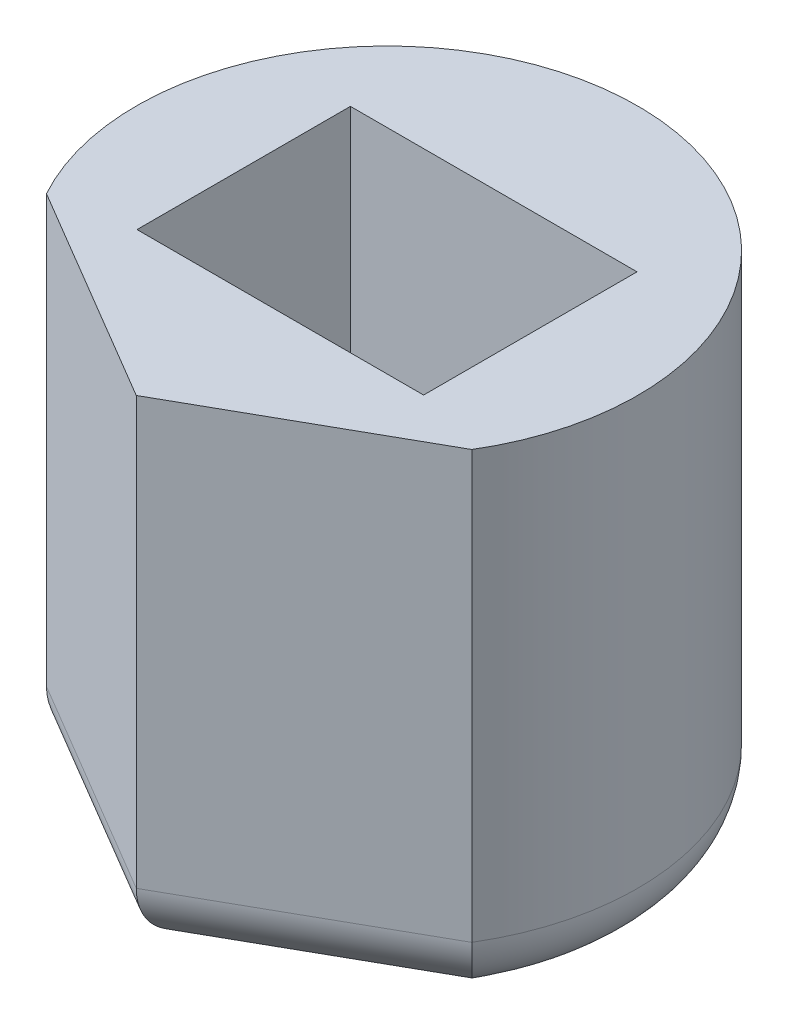
ISO-10303-21;
HEADER;
FILE_DESCRIPTION(('STEP AP214'),'2;1');
FILE_NAME('part.step','',(''),(''),'','','');
FILE_SCHEMA(('AUTOMOTIVE_DESIGN { 1 0 10303 214 1 1 1 1 }'));
ENDSEC;
DATA;
#1=APPLICATION_CONTEXT('core data for automotive mechanical design processes');
#2=APPLICATION_PROTOCOL_DEFINITION('international standard','automotive_design',2000,#1);
#3=PRODUCT_CONTEXT('',#1,'mechanical');
#4=PRODUCT('Part','Part','',(#3));
#5=PRODUCT_RELATED_PRODUCT_CATEGORY('part','',(#4));
#6=PRODUCT_DEFINITION_FORMATION('','',#4);
#7=PRODUCT_DEFINITION_CONTEXT('part definition',#1,'design');
#8=PRODUCT_DEFINITION('design','',#6,#7);
#9=PRODUCT_DEFINITION_SHAPE('','',#8);
#10=(LENGTH_UNIT() NAMED_UNIT(*) SI_UNIT(.MILLI.,.METRE.));
#11=(NAMED_UNIT(*) PLANE_ANGLE_UNIT() SI_UNIT($,.RADIAN.));
#12=(NAMED_UNIT(*) SI_UNIT($,.STERADIAN.) SOLID_ANGLE_UNIT());
#13=UNCERTAINTY_MEASURE_WITH_UNIT(LENGTH_MEASURE(1.E-05),#10,'distance_accuracy_value','');
#14=(GEOMETRIC_REPRESENTATION_CONTEXT(3) GLOBAL_UNCERTAINTY_ASSIGNED_CONTEXT((#13)) GLOBAL_UNIT_ASSIGNED_CONTEXT((#10,
#11,#12)) REPRESENTATION_CONTEXT('',''));
#15=CARTESIAN_POINT('',(0.,0.,0.));
#16=DIRECTION('',(0.,0.,1.));
#17=DIRECTION('',(1.,0.,0.));
#18=AXIS2_PLACEMENT_3D('',#15,#16,#17);
#19=CARTESIAN_POINT('',(2.35,6.,-1.75));
#20=DIRECTION('',(-1.,0.,0.));
#21=DIRECTION('',(0.,0.,1.));
#22=AXIS2_PLACEMENT_3D('',#19,#20,#21);
#23=PLANE('',#22);
#24=DIRECTION('',(0.,-1.,0.));
#25=VECTOR('',#24,1.);
#26=CARTESIAN_POINT('',(2.35,6.,-1.75));
#27=LINE('',#26,#25);
#28=CARTESIAN_POINT('',(2.35,6.,-1.75));
#29=VERTEX_POINT('',#28);
#30=CARTESIAN_POINT('',(2.35,0.,-1.75));
#31=VERTEX_POINT('',#30);
#32=EDGE_CURVE('E150',#29,#31,#27,.T.);
#33=ORIENTED_EDGE('',*,*,#32,.T.);
#34=DIRECTION('',(0.,0.,1.));
#35=VECTOR('',#34,1.);
#36=CARTESIAN_POINT('',(2.35,0.,1.75));
#37=LINE('',#36,#35);
#38=CARTESIAN_POINT('',(2.35,0.,1.75));
#39=VERTEX_POINT('',#38);
#40=EDGE_CURVE('E131',#31,#39,#37,.T.);
#41=ORIENTED_EDGE('',*,*,#40,.T.);
#42=DIRECTION('',(0.,-1.,0.));
#43=VECTOR('',#42,1.);
#44=CARTESIAN_POINT('',(2.35,6.,1.75));
#45=LINE('',#44,#43);
#46=CARTESIAN_POINT('',(2.35,6.,1.75));
#47=VERTEX_POINT('',#46);
#48=EDGE_CURVE('E154',#47,#39,#45,.T.);
#49=ORIENTED_EDGE('',*,*,#48,.F.);
#50=DIRECTION('',(0.,0.,-1.));
#51=VECTOR('',#50,1.);
#52=CARTESIAN_POINT('',(2.35,6.,-1.75));
#53=LINE('',#52,#51);
#54=EDGE_CURVE('E271',#47,#29,#53,.T.);
#55=ORIENTED_EDGE('',*,*,#54,.T.);
#56=EDGE_LOOP('',(#33,#41,#49,#55));
#57=FACE_BOUND('',#56,.T.);
#58=ADVANCED_FACE('F35',(#57),#23,.T.);
#59=CARTESIAN_POINT('',(-2.35,6.,-1.75));
#60=DIRECTION('',(0.,0.,1.));
#61=DIRECTION('',(1.,0.,0.));
#62=AXIS2_PLACEMENT_3D('',#59,#60,#61);
#63=PLANE('',#62);
#64=DIRECTION('',(0.,-1.,0.));
#65=VECTOR('',#64,1.);
#66=CARTESIAN_POINT('',(-2.35,6.,-1.75));
#67=LINE('',#66,#65);
#68=CARTESIAN_POINT('',(-2.35,6.,-1.75));
#69=VERTEX_POINT('',#68);
#70=CARTESIAN_POINT('',(-2.35,0.,-1.75));
#71=VERTEX_POINT('',#70);
#72=EDGE_CURVE('E142',#69,#71,#67,.T.);
#73=ORIENTED_EDGE('',*,*,#72,.T.);
#74=DIRECTION('',(1.,0.,0.));
#75=VECTOR('',#74,1.);
#76=CARTESIAN_POINT('',(-2.35,0.,-1.75));
#77=LINE('',#76,#75);
#78=EDGE_CURVE('E128',#71,#31,#77,.T.);
#79=ORIENTED_EDGE('',*,*,#78,.T.);
#80=ORIENTED_EDGE('',*,*,#32,.F.);
#81=DIRECTION('',(-1.,0.,0.));
#82=VECTOR('',#81,1.);
#83=CARTESIAN_POINT('',(-2.35,6.,-1.75));
#84=LINE('',#83,#82);
#85=EDGE_CURVE('E149',#29,#69,#84,.T.);
#86=ORIENTED_EDGE('',*,*,#85,.T.);
#87=EDGE_LOOP('',(#73,#79,#80,#86));
#88=FACE_BOUND('',#87,.T.);
#89=ADVANCED_FACE('F147',(#88),#63,.T.);
#90=CARTESIAN_POINT('',(-2.35,6.,-1.75));
#91=DIRECTION('',(1.,0.,0.));
#92=DIRECTION('',(0.,0.,-1.));
#93=AXIS2_PLACEMENT_3D('',#90,#91,#92);
#94=PLANE('',#93);
#95=DIRECTION('',(0.,-1.,0.));
#96=VECTOR('',#95,1.);
#97=CARTESIAN_POINT('',(-2.35,6.,1.75));
#98=LINE('',#97,#96);
#99=CARTESIAN_POINT('',(-2.35,6.,1.75));
#100=VERTEX_POINT('',#99);
#101=CARTESIAN_POINT('',(-2.35,0.,1.75));
#102=VERTEX_POINT('',#101);
#103=EDGE_CURVE('E144',#100,#102,#98,.T.);
#104=ORIENTED_EDGE('',*,*,#103,.T.);
#105=DIRECTION('',(0.,0.,-1.));
#106=VECTOR('',#105,1.);
#107=CARTESIAN_POINT('',(-2.35,0.,1.75));
#108=LINE('',#107,#106);
#109=EDGE_CURVE('E53',#102,#71,#108,.T.);
#110=ORIENTED_EDGE('',*,*,#109,.T.);
#111=ORIENTED_EDGE('',*,*,#72,.F.);
#112=DIRECTION('',(0.,0.,1.));
#113=VECTOR('',#112,1.);
#114=CARTESIAN_POINT('',(-2.35,6.,-1.75));
#115=LINE('',#114,#113);
#116=EDGE_CURVE('E274',#69,#100,#115,.T.);
#117=ORIENTED_EDGE('',*,*,#116,.T.);
#118=EDGE_LOOP('',(#104,#110,#111,#117));
#119=FACE_BOUND('',#118,.T.);
#120=ADVANCED_FACE('F140',(#119),#94,.T.);
#121=CARTESIAN_POINT('',(-2.35,6.,1.75));
#122=DIRECTION('',(0.,0.,-1.));
#123=DIRECTION('',(-1.,0.,0.));
#124=AXIS2_PLACEMENT_3D('',#121,#122,#123);
#125=PLANE('',#124);
#126=ORIENTED_EDGE('',*,*,#48,.T.);
#127=DIRECTION('',(-1.,0.,0.));
#128=VECTOR('',#127,1.);
#129=CARTESIAN_POINT('',(-2.35,0.,1.75));
#130=LINE('',#129,#128);
#131=EDGE_CURVE('E280',#39,#102,#130,.T.);
#132=ORIENTED_EDGE('',*,*,#131,.T.);
#133=ORIENTED_EDGE('',*,*,#103,.F.);
#134=DIRECTION('',(1.,0.,0.));
#135=VECTOR('',#134,1.);
#136=CARTESIAN_POINT('',(-2.35,6.,1.75));
#137=LINE('',#136,#135);
#138=EDGE_CURVE('E276',#100,#47,#137,.T.);
#139=ORIENTED_EDGE('',*,*,#138,.T.);
#140=EDGE_LOOP('',(#126,#132,#133,#139));
#141=FACE_BOUND('',#140,.T.);
#142=ADVANCED_FACE('F229',(#141),#125,.T.);
#143=CARTESIAN_POINT('',(0.,6.,0.));
#144=DIRECTION('',(0.,1.,0.));
#145=DIRECTION('',(0.,0.,1.));
#146=AXIS2_PLACEMENT_3D('',#143,#144,#145);
#147=PLANE('',#146);
#148=DIRECTION('',(-0.871083125525588,0.,0.491135611032812));
#149=VECTOR('',#148,1.);
#150=CARTESIAN_POINT('',(0.,6.,4.11181198358812));
#151=LINE('',#150,#149);
#152=CARTESIAN_POINT('',(3.51823033783962,6.,2.12815720243683));
#153=VERTEX_POINT('',#152);
#154=CARTESIAN_POINT('',(0.,6.,4.11181198358812));
#155=VERTEX_POINT('',#154);
#156=EDGE_CURVE('E259',#153,#155,#151,.T.);
#157=ORIENTED_EDGE('',*,*,#156,.F.);
#158=CARTESIAN_POINT('',(0.,6.,0.));
#159=DIRECTION('',(0.,1.,0.));
#160=DIRECTION('',(0.,0.,1.));
#161=AXIS2_PLACEMENT_3D('',#158,#159,#160);
#162=CIRCLE('',#161,4.11181198358812);
#163=CARTESIAN_POINT('',(-3.60215336947691,6.,1.98279824771584));
#164=VERTEX_POINT('',#163);
#165=EDGE_CURVE('E152',#153,#164,#162,.T.);
#166=ORIENTED_EDGE('',*,*,#165,.T.);
#167=DIRECTION('',(-0.860877478620404,0.,-0.508812309996698));
#168=VECTOR('',#167,1.);
#169=CARTESIAN_POINT('',(0.,6.,4.11181198358812));
#170=LINE('',#169,#168);
#171=EDGE_CURVE('E260',#155,#164,#170,.T.);
#172=ORIENTED_EDGE('',*,*,#171,.F.);
#173=EDGE_LOOP('',(#157,#166,#172));
#174=FACE_BOUND('',#173,.T.);
#175=ORIENTED_EDGE('',*,*,#85,.F.);
#176=ORIENTED_EDGE('',*,*,#54,.F.);
#177=ORIENTED_EDGE('',*,*,#138,.F.);
#178=ORIENTED_EDGE('',*,*,#116,.F.);
#179=EDGE_LOOP('',(#175,#176,#177,#178));
#180=FACE_BOUND('',#179,.T.);
#181=ADVANCED_FACE('F226',(#174,#180),#147,.T.);
#182=CARTESIAN_POINT('',(0.,6.,0.));
#183=DIRECTION('',(0.,-1.,0.));
#184=DIRECTION('',(0.,0.,-1.));
#185=AXIS2_PLACEMENT_3D('',#182,#183,#184);
#186=CYLINDRICAL_SURFACE('',#185,4.11181198358812);
#187=DIRECTION('',(0.,-1.,0.));
#188=VECTOR('',#187,1.);
#189=CARTESIAN_POINT('',(3.51823033783962,6.,2.12815720243683));
#190=LINE('',#189,#188);
#191=CARTESIAN_POINT('',(3.51823033783962,-1.,2.12815720243683));
#192=VERTEX_POINT('',#191);
#193=EDGE_CURVE('E162',#153,#192,#190,.T.);
#194=ORIENTED_EDGE('',*,*,#193,.T.);
#195=CARTESIAN_POINT('',(0.,-1.,0.));
#196=DIRECTION('',(0.,-1.,0.));
#197=DIRECTION('',(0.,0.,-1.));
#198=AXIS2_PLACEMENT_3D('',#195,#196,#197);
#199=CIRCLE('',#198,4.11181198358812);
#200=CARTESIAN_POINT('',(-3.60215336947691,-1.,1.98279824771583));
#201=VERTEX_POINT('',#200);
#202=EDGE_CURVE('E176',#192,#201,#199,.F.);
#203=ORIENTED_EDGE('',*,*,#202,.T.);
#204=DIRECTION('',(0.,-1.,0.));
#205=VECTOR('',#204,1.);
#206=CARTESIAN_POINT('',(-3.60215336947691,6.,1.98279824771583));
#207=LINE('',#206,#205);
#208=EDGE_CURVE('E160',#201,#164,#207,.F.);
#209=ORIENTED_EDGE('',*,*,#208,.T.);
#210=ORIENTED_EDGE('',*,*,#165,.F.);
#211=EDGE_LOOP('',(#194,#203,#209,#210));
#212=FACE_BOUND('',#211,.T.);
#213=ADVANCED_FACE('F228',(#212),#186,.T.);
#214=CARTESIAN_POINT('',(0.,0.,4.11181198358812));
#215=DIRECTION('',(-0.491135611032812,0.,-0.871083125525588));
#216=DIRECTION('',(-0.871083125525588,0.,0.491135611032812));
#217=AXIS2_PLACEMENT_3D('',#214,#215,#216);
#218=PLANE('',#217);
#219=DIRECTION('',(0.,1.,0.));
#220=VECTOR('',#219,1.);
#221=CARTESIAN_POINT('',(0.,0.,4.11181198358812));
#222=LINE('',#221,#220);
#223=CARTESIAN_POINT('',(0.,-1.,4.11181198358812));
#224=VERTEX_POINT('',#223);
#225=EDGE_CURVE('E264',#224,#155,#222,.T.);
#226=ORIENTED_EDGE('',*,*,#225,.F.);
#227=DIRECTION('',(-0.871083125525588,0.,0.491135611032812));
#228=VECTOR('',#227,1.);
#229=CARTESIAN_POINT('',(3.51823033783962,-1.,2.12815720243683));
#230=LINE('',#229,#228);
#231=EDGE_CURVE('E11',#224,#192,#230,.F.);
#232=ORIENTED_EDGE('',*,*,#231,.T.);
#233=ORIENTED_EDGE('',*,*,#193,.F.);
#234=ORIENTED_EDGE('',*,*,#156,.T.);
#235=EDGE_LOOP('',(#226,#232,#233,#234));
#236=FACE_BOUND('',#235,.T.);
#237=ADVANCED_FACE('F232',(#236),#218,.F.);
#238=CARTESIAN_POINT('',(0.,0.,4.11181198358812));
#239=DIRECTION('',(0.508812309996698,0.,-0.860877478620404));
#240=DIRECTION('',(-0.860877478620404,0.,-0.508812309996698));
#241=AXIS2_PLACEMENT_3D('',#238,#239,#240);
#242=PLANE('',#241);
#243=ORIENTED_EDGE('',*,*,#208,.F.);
#244=DIRECTION('',(-0.860877478620404,0.,-0.508812309996698));
#245=VECTOR('',#244,1.);
#246=CARTESIAN_POINT('',(0.,-1.,4.11181198358812));
#247=LINE('',#246,#245);
#248=EDGE_CURVE('E61',#201,#224,#247,.F.);
#249=ORIENTED_EDGE('',*,*,#248,.T.);
#250=ORIENTED_EDGE('',*,*,#225,.T.);
#251=ORIENTED_EDGE('',*,*,#171,.T.);
#252=EDGE_LOOP('',(#243,#249,#250,#251));
#253=FACE_BOUND('',#252,.T.);
#254=ADVANCED_FACE('F237',(#253),#242,.F.);
#255=CARTESIAN_POINT('',(0.,-2.,0.));
#256=DIRECTION('',(0.,-1.,0.));
#257=DIRECTION('',(0.,0.,-1.));
#258=AXIS2_PLACEMENT_3D('',#255,#256,#257);
#259=PLANE('',#258);
#260=DIRECTION('',(-0.871083125525588,0.,0.491135611032812));
#261=VECTOR('',#260,1.);
#262=CARTESIAN_POINT('',(-0.491135611032812,-2.,3.24072885806253));
#263=LINE('',#262,#261);
#264=CARTESIAN_POINT('',(2.15283628557141,-2.,1.75));
#265=VERTEX_POINT('',#264);
#266=CARTESIAN_POINT('',(0.0117844659759248,-2.,2.95717158082412));
#267=VERTEX_POINT('',#266);
#268=EDGE_CURVE('E165',#265,#267,#263,.T.);
#269=ORIENTED_EDGE('',*,*,#268,.T.);
#270=DIRECTION('',(-0.860877478620404,0.,-0.508812309996698));
#271=VECTOR('',#270,1.);
#272=CARTESIAN_POINT('',(-3.09334105948021,-2.,1.12192076909543));
#273=LINE('',#272,#271);
#274=CARTESIAN_POINT('',(-2.03067167422403,-2.,1.75));
#275=VERTEX_POINT('',#274);
#276=EDGE_CURVE('E167',#267,#275,#273,.T.);
#277=ORIENTED_EDGE('',*,*,#276,.T.);
#278=DIRECTION('',(-1.,0.,0.));
#279=VECTOR('',#278,1.);
#280=CARTESIAN_POINT('',(-2.35,-2.,1.75));
#281=LINE('',#280,#279);
#282=CARTESIAN_POINT('',(-2.35,-2.,1.75));
#283=VERTEX_POINT('',#282);
#284=EDGE_CURVE('E290',#275,#283,#281,.T.);
#285=ORIENTED_EDGE('',*,*,#284,.T.);
#286=DIRECTION('',(0.,0.,-1.));
#287=VECTOR('',#286,1.);
#288=CARTESIAN_POINT('',(-2.35,-2.,1.75));
#289=LINE('',#288,#287);
#290=CARTESIAN_POINT('',(-2.35,-2.,1.56126445153865));
#291=VERTEX_POINT('',#290);
#292=EDGE_CURVE('E256',#283,#291,#289,.T.);
#293=ORIENTED_EDGE('',*,*,#292,.T.);
#294=DIRECTION('',(-0.860877478620404,0.,-0.508812309996698));
#295=VECTOR('',#294,1.);
#296=CARTESIAN_POINT('',(-3.09334105948021,-2.,1.12192076909543));
#297=LINE('',#296,#295);
#298=CARTESIAN_POINT('',(-2.84015961735463,-2.,1.27156091837969));
#299=VERTEX_POINT('',#298);
#300=EDGE_CURVE('E174',#291,#299,#297,.T.);
#301=ORIENTED_EDGE('',*,*,#300,.T.);
#302=CARTESIAN_POINT('',(0.,-2.,0.));
#303=DIRECTION('',(0.,-1.,0.));
#304=DIRECTION('',(0.,0.,-1.));
#305=AXIS2_PLACEMENT_3D('',#302,#303,#304);
#306=CIRCLE('',#305,3.11181198358812);
#307=CARTESIAN_POINT('',(2.78127029440949,-2.,1.3956752382406));
#308=VERTEX_POINT('',#307);
#309=EDGE_CURVE('E171',#299,#308,#306,.T.);
#310=ORIENTED_EDGE('',*,*,#309,.T.);
#311=DIRECTION('',(-0.871083125525588,0.,0.491135611032812));
#312=VECTOR('',#311,1.);
#313=CARTESIAN_POINT('',(-0.491135611032812,-2.,3.24072885806253));
#314=LINE('',#313,#312);
#315=CARTESIAN_POINT('',(2.35,-2.,1.63883480976519));
#316=VERTEX_POINT('',#315);
#317=EDGE_CURVE('E169',#308,#316,#314,.T.);
#318=ORIENTED_EDGE('',*,*,#317,.T.);
#319=DIRECTION('',(0.,0.,1.));
#320=VECTOR('',#319,1.);
#321=CARTESIAN_POINT('',(2.35,-2.,1.75));
#322=LINE('',#321,#320);
#323=CARTESIAN_POINT('',(2.35,-2.,1.75));
#324=VERTEX_POINT('',#323);
#325=EDGE_CURVE('E288',#316,#324,#322,.T.);
#326=ORIENTED_EDGE('',*,*,#325,.T.);
#327=EDGE_CURVE('E145',#324,#265,#281,.T.);
#328=ORIENTED_EDGE('',*,*,#327,.T.);
#329=EDGE_LOOP('',(#269,#277,#285,#293,#301,#310,#318,#326,#328));
#330=FACE_BOUND('',#329,.T.);
#331=ADVANCED_FACE('F214',(#330),#259,.T.);
#332=CARTESIAN_POINT('',(-1.29226437474176,-1.,2.18642763703157));
#333=DIRECTION('',(0.860877478620404,0.,0.508812309996698));
#334=DIRECTION('',(0.508812309996698,0.,-0.860877478620404));
#335=AXIS2_PLACEMENT_3D('',#332,#333,#334);
#336=CYLINDRICAL_SURFACE('',#335,1.);
#337=CARTESIAN_POINT('',(-2.03067167422403,-1.,1.75));
#338=DIRECTION('',(0.,0.,-1.));
#339=DIRECTION('',(1.,0.,0.));
#340=AXIS2_PLACEMENT_3D('',#337,#338,#339);
#341=ELLIPSE('',#340,1.96536125473554,1.);
#342=CARTESIAN_POINT('',(-2.35,-1.98671213635044,1.75));
#343=VERTEX_POINT('',#342);
#344=EDGE_CURVE('E182',#275,#343,#341,.T.);
#345=ORIENTED_EDGE('',*,*,#344,.F.);
#346=ORIENTED_EDGE('',*,*,#276,.F.);
#347=CARTESIAN_POINT('',(0.0117844659759248,-1.,2.95717158082412));
#348=DIRECTION('',(0.999947921029514,0.,0.0102056469051838));
#349=DIRECTION('',(0.0102056469051838,0.,-0.999947921029514));
#350=AXIS2_PLACEMENT_3D('',#347,#348,#349);
#351=ELLIPSE('',#350,1.15470053837925,1.);
#352=EDGE_CURVE('E40',#224,#267,#351,.T.);
#353=ORIENTED_EDGE('',*,*,#352,.F.);
#354=ORIENTED_EDGE('',*,*,#248,.F.);
#355=CARTESIAN_POINT('',(-3.60215336947691,-1.,1.98279824771583));
#356=CARTESIAN_POINT('',(-3.60215341711431,-1.0273852702056,1.98279858822179));
#357=CARTESIAN_POINT('',(-3.60131566096911,-1.05475718837957,1.98198576931951));
#358=CARTESIAN_POINT('',(-3.59797478681862,-1.10930012740476,1.97874626252752));
#359=CARTESIAN_POINT('',(-3.59547185385305,-1.1364711702387,1.97631975395614));
#360=CARTESIAN_POINT('',(-3.58549692789412,-1.21729677069871,1.96665413199477));
#361=CARTESIAN_POINT('',(-3.57555868673311,-1.27040159732565,1.95702878143871));
#362=CARTESIAN_POINT('',(-3.54940782117867,-1.373518866995,1.93175733329807));
#363=CARTESIAN_POINT('',(-3.53319414648588,-1.4235307907622,1.91611022787399));
#364=CARTESIAN_POINT('',(-3.49497888417345,-1.51913755324321,1.87934405977904));
#365=CARTESIAN_POINT('',(-3.47297714781747,-1.56473227840666,1.8582248564914));
#366=CARTESIAN_POINT('',(-3.42347782837097,-1.65092966744954,1.81089719153305));
#367=CARTESIAN_POINT('',(-3.39590831911899,-1.69145440791704,1.78462226793662));
#368=CARTESIAN_POINT('',(-3.33623681405785,-1.76579555294529,1.72802635222626));
#369=CARTESIAN_POINT('',(-3.30413340356225,-1.79960985573699,1.69770409741015));
#370=CARTESIAN_POINT('',(-3.23510605837195,-1.86079116365881,1.63287255000625));
#371=CARTESIAN_POINT('',(-3.19805622165271,-1.88790278813624,1.59825666363483));
#372=CARTESIAN_POINT('',(-3.12101147275468,-1.93358845277378,1.52675116745616));
#373=CARTESIAN_POINT('',(-3.08101696856371,-1.95216367309179,1.48986187274781));
#374=CARTESIAN_POINT('',(-3.00859139030004,-1.97718864334135,1.42355244733934));
#375=CARTESIAN_POINT('',(-2.97654600234073,-1.98544775936052,1.39437424183376));
#376=CARTESIAN_POINT('',(-2.91181324986686,-1.99666667470804,1.33579152195008));
#377=CARTESIAN_POINT('',(-2.87912716140698,-1.99963610192397,1.30638751676602));
#378=CARTESIAN_POINT('',(-2.84429632491851,-1.99998954795389,1.27525600475632));
#379=CARTESIAN_POINT('',(-2.84222808990674,-2.00000002691314,1.27340818825243));
#380=CARTESIAN_POINT('',(-2.84015961735463,-2.,1.27156091837969));
#381=B_SPLINE_CURVE_WITH_KNOTS('',3,(#355,#356,#357,#358,#359,#360,#361,#362,#363,#364,#365,
#366,#367,#368,#369,#370,#371,#372,#373,#374,#375,#376,#377,#378,#379,#380),.UNSPECIFIED.,.F.,
.F.,(4,2,2,2,2,2,2,2,2,2,2,2,4),(0.,0.0821045475378612,0.164199972882307,0.327982776292728,
0.491793003372148,0.655607440308782,0.821691683199439,0.987827863342561,1.15955719962505,
1.33126278717892,1.4633249754458,1.5951465476534,1.60346686075192),.UNSPECIFIED.);
#382=EDGE_CURVE('E196',#299,#201,#381,.F.);
#383=ORIENTED_EDGE('',*,*,#382,.F.);
#384=ORIENTED_EDGE('',*,*,#300,.F.);
#385=CARTESIAN_POINT('',(-2.35,-1.,1.56126445153865));
#386=DIRECTION('',(1.,0.,0.));
#387=DIRECTION('',(0.,0.,1.));
#388=AXIS2_PLACEMENT_3D('',#385,#386,#387);
#389=ELLIPSE('',#388,1.16160548374729,1.);
#390=EDGE_CURVE('E185',#343,#291,#389,.T.);
#391=ORIENTED_EDGE('',*,*,#390,.F.);
#392=EDGE_LOOP('',(#345,#346,#353,#354,#383,#384,#391));
#393=FACE_BOUND('',#392,.T.);
#394=ADVANCED_FACE('F37',(#393),#336,.T.);
#395=CARTESIAN_POINT('',(1.267979557887,-1.,2.24890146748689));
#396=DIRECTION('',(0.871083125525588,0.,-0.491135611032812));
#397=DIRECTION('',(-0.491135611032812,0.,-0.871083125525588));
#398=AXIS2_PLACEMENT_3D('',#395,#396,#397);
#399=CYLINDRICAL_SURFACE('',#398,1.);
#400=CARTESIAN_POINT('',(2.35,-1.,1.63883480976519));
#401=DIRECTION('',(-1.,0.,0.));
#402=DIRECTION('',(0.,0.,-1.));
#403=AXIS2_PLACEMENT_3D('',#400,#401,#402);
#404=ELLIPSE('',#403,1.14799606455082,1.);
#405=CARTESIAN_POINT('',(2.35,-1.99530053397984,1.75));
#406=VERTEX_POINT('',#405);
#407=EDGE_CURVE('E45',#316,#406,#404,.T.);
#408=ORIENTED_EDGE('',*,*,#407,.F.);
#409=ORIENTED_EDGE('',*,*,#317,.F.);
#410=CARTESIAN_POINT('',(3.51823033783962,-1.,2.12815720243683));
#411=CARTESIAN_POINT('',(3.51823035682849,-1.02744091501146,2.12815751481245));
#412=CARTESIAN_POINT('',(3.51741681832114,-1.05486846931908,2.12731835223006));
#413=CARTESIAN_POINT('',(3.51417233546199,-1.10952266306828,2.12397358912433));
#414=CARTESIAN_POINT('',(3.51174156312683,-1.1367493235665,2.12146816583237));
#415=CARTESIAN_POINT('',(3.50205334669458,-1.21774465530638,2.11148712400532));
#416=CARTESIAN_POINT('',(3.49239989134162,-1.27096309682667,2.10154659547714));
#417=CARTESIAN_POINT('',(3.466992916515,-1.37430354845713,2.07543994343947));
#418=CARTESIAN_POINT('',(3.45123823591032,-1.42442496706277,2.05927263490772));
#419=CARTESIAN_POINT('',(3.41409601485355,-1.52023659733,2.02127096985355));
#420=CARTESIAN_POINT('',(3.3927084374565,-1.56592677992537,1.99943657616195));
#421=CARTESIAN_POINT('',(3.34460255744936,-1.65224820870765,1.95051130385806));
#422=CARTESIAN_POINT('',(3.31781924876383,-1.69280685376446,1.92335644761579));
#423=CARTESIAN_POINT('',(3.25983845639645,-1.76718851642127,1.86484386406415));
#424=CARTESIAN_POINT('',(3.22863958848809,-1.80100941378027,1.83348481895362));
#425=CARTESIAN_POINT('',(3.16162790062843,-1.86208585128089,1.76649347333586));
#426=CARTESIAN_POINT('',(3.12570152225613,-1.88910371635956,1.73075839656131));
#427=CARTESIAN_POINT('',(3.05099016594875,-1.93458071964156,1.65691883793246));
#428=CARTESIAN_POINT('',(3.01220572129324,-1.95304144983686,1.6188147983035));
#429=CARTESIAN_POINT('',(2.94240920023451,-1.9776816869473,1.55072846500624));
#430=CARTESIAN_POINT('',(2.91178625701754,-1.98575171188095,1.52101098971699));
#431=CARTESIAN_POINT('',(2.84993223730556,-1.99672210549494,1.4613303893404));
#432=CARTESIAN_POINT('',(2.81870236102324,-1.99963179886341,1.4313678058277));
#433=CARTESIAN_POINT('',(2.78535524420078,-1.9999891018915,1.39956828296814));
#434=CARTESIAN_POINT('',(2.78331289383473,-2.0000000281601,1.39762148986582));
#435=CARTESIAN_POINT('',(2.78127029440949,-2.,1.3956752382406));
#436=B_SPLINE_CURVE_WITH_KNOTS('',3,(#410,#411,#412,#413,#414,#415,#416,#417,#418,#419,#420,
#421,#422,#423,#424,#425,#426,#427,#428,#429,#430,#431,#432,#433,#434,#435),.UNSPECIFIED.,.F.,
.F.,(4,2,2,2,2,2,2,2,2,2,2,2,4),(0.,0.0822714414280478,0.164534133475197,0.328661464051853,
0.492820045246359,0.656979703148492,0.823250111494569,0.989572759613367,1.16108301223645,
1.33256134381972,1.46256259884859,1.5923287021179,1.6007933432094),.UNSPECIFIED.);
#437=EDGE_CURVE('E191',#192,#308,#436,.T.);
#438=ORIENTED_EDGE('',*,*,#437,.F.);
#439=ORIENTED_EDGE('',*,*,#231,.F.);
#440=ORIENTED_EDGE('',*,*,#352,.T.);
#441=ORIENTED_EDGE('',*,*,#268,.F.);
#442=CARTESIAN_POINT('',(2.15283628557141,-1.,1.75));
#443=DIRECTION('',(0.,0.,-1.));
#444=DIRECTION('',(1.,0.,0.));
#445=AXIS2_PLACEMENT_3D('',#442,#443,#444);
#446=ELLIPSE('',#445,2.03609752079898,1.);
#447=EDGE_CURVE('E179',#406,#265,#446,.T.);
#448=ORIENTED_EDGE('',*,*,#447,.F.);
#449=EDGE_LOOP('',(#408,#409,#438,#439,#440,#441,#448));
#450=FACE_BOUND('',#449,.T.);
#451=ADVANCED_FACE('F204',(#450),#399,.T.);
#452=CARTESIAN_POINT('',(0.,-1.,0.));
#453=DIRECTION('',(0.,-1.,0.));
#454=DIRECTION('',(0.,0.,-1.));
#455=AXIS2_PLACEMENT_3D('',#452,#453,#454);
#456=TOROIDAL_SURFACE('',#455,3.11181198358812,1.);
#457=ORIENTED_EDGE('',*,*,#382,.T.);
#458=ORIENTED_EDGE('',*,*,#202,.F.);
#459=ORIENTED_EDGE('',*,*,#437,.T.);
#460=ORIENTED_EDGE('',*,*,#309,.F.);
#461=EDGE_LOOP('',(#457,#458,#459,#460));
#462=FACE_BOUND('',#461,.T.);
#463=ADVANCED_FACE('F201',(#462),#456,.T.);
#464=CARTESIAN_POINT('',(2.35,0.,1.75));
#465=DIRECTION('',(1.,0.,0.));
#466=DIRECTION('',(0.,0.,-1.));
#467=AXIS2_PLACEMENT_3D('',#464,#465,#466);
#468=PLANE('',#467);
#469=ORIENTED_EDGE('',*,*,#325,.F.);
#470=ORIENTED_EDGE('',*,*,#407,.T.);
#471=DIRECTION('',(0.,-1.,0.));
#472=VECTOR('',#471,1.);
#473=CARTESIAN_POINT('',(2.35,0.,1.75));
#474=LINE('',#473,#472);
#475=EDGE_CURVE('E267',#406,#324,#474,.T.);
#476=ORIENTED_EDGE('',*,*,#475,.T.);
#477=EDGE_LOOP('',(#469,#470,#476));
#478=FACE_BOUND('',#477,.T.);
#479=ADVANCED_FACE('F212',(#478),#468,.T.);
#480=CARTESIAN_POINT('',(-2.35,0.,1.75));
#481=DIRECTION('',(0.,0.,1.));
#482=DIRECTION('',(1.,0.,0.));
#483=AXIS2_PLACEMENT_3D('',#480,#481,#482);
#484=PLANE('',#483);
#485=ORIENTED_EDGE('',*,*,#475,.F.);
#486=ORIENTED_EDGE('',*,*,#447,.T.);
#487=ORIENTED_EDGE('',*,*,#327,.F.);
#488=EDGE_LOOP('',(#485,#486,#487));
#489=FACE_BOUND('',#488,.T.);
#490=ADVANCED_FACE('F299',(#489),#484,.T.);
#491=ORIENTED_EDGE('',*,*,#284,.F.);
#492=ORIENTED_EDGE('',*,*,#344,.T.);
#493=DIRECTION('',(0.,-1.,0.));
#494=VECTOR('',#493,1.);
#495=CARTESIAN_POINT('',(-2.35,0.,1.75));
#496=LINE('',#495,#494);
#497=EDGE_CURVE('E197',#343,#283,#496,.T.);
#498=ORIENTED_EDGE('',*,*,#497,.T.);
#499=EDGE_LOOP('',(#491,#492,#498));
#500=FACE_BOUND('',#499,.T.);
#501=ADVANCED_FACE('F301',(#500),#484,.T.);
#502=CARTESIAN_POINT('',(-2.35,0.,1.75));
#503=DIRECTION('',(-1.,0.,0.));
#504=DIRECTION('',(0.,0.,1.));
#505=AXIS2_PLACEMENT_3D('',#502,#503,#504);
#506=PLANE('',#505);
#507=ORIENTED_EDGE('',*,*,#497,.F.);
#508=ORIENTED_EDGE('',*,*,#390,.T.);
#509=ORIENTED_EDGE('',*,*,#292,.F.);
#510=EDGE_LOOP('',(#507,#508,#509));
#511=FACE_BOUND('',#510,.T.);
#512=ADVANCED_FACE('F303',(#511),#506,.T.);
#513=CARTESIAN_POINT('',(0.,0.,0.));
#514=DIRECTION('',(0.,-1.,0.));
#515=DIRECTION('',(0.,0.,-1.));
#516=AXIS2_PLACEMENT_3D('',#513,#514,#515);
#517=PLANE('',#516);
#518=ORIENTED_EDGE('',*,*,#109,.F.);
#519=ORIENTED_EDGE('',*,*,#131,.F.);
#520=ORIENTED_EDGE('',*,*,#40,.F.);
#521=ORIENTED_EDGE('',*,*,#78,.F.);
#522=EDGE_LOOP('',(#518,#519,#520,#521));
#523=FACE_BOUND('',#522,.T.);
#524=ADVANCED_FACE('F129',(#523),#517,.F.);
#525=CLOSED_SHELL('',(#58,#89,#120,#142,#181,#213,#237,#254,#331,#394,#451,#463,#479,#490,#501,
#512,#524));
#526=MANIFOLD_SOLID_BREP('B2',#525);
#527=ADVANCED_BREP_SHAPE_REPRESENTATION('',(#18,#526),#14);
#528=SHAPE_DEFINITION_REPRESENTATION(#9,#527);
ENDSEC;
END-ISO-10303-21;
